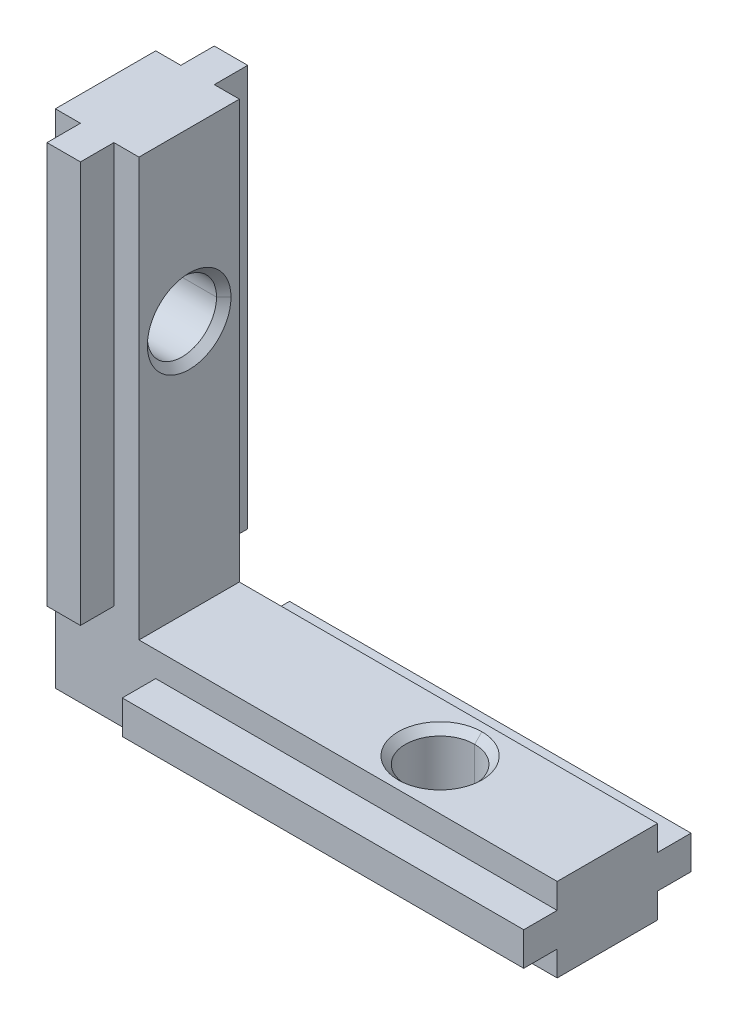
ISO-10303-21;
HEADER;
FILE_DESCRIPTION(('STEP AP214'),'2;1');
FILE_NAME('part.step','',(''),(''),'','','');
FILE_SCHEMA(('AUTOMOTIVE_DESIGN { 1 0 10303 214 1 1 1 1 }'));
ENDSEC;
DATA;
#1=APPLICATION_CONTEXT('core data for automotive mechanical design processes');
#2=APPLICATION_PROTOCOL_DEFINITION('international standard','automotive_design',2000,#1);
#3=PRODUCT_CONTEXT('',#1,'mechanical');
#4=PRODUCT('Part','Part','',(#3));
#5=PRODUCT_RELATED_PRODUCT_CATEGORY('part','',(#4));
#6=PRODUCT_DEFINITION_FORMATION('','',#4);
#7=PRODUCT_DEFINITION_CONTEXT('part definition',#1,'design');
#8=PRODUCT_DEFINITION('design','',#6,#7);
#9=PRODUCT_DEFINITION_SHAPE('','',#8);
#10=(LENGTH_UNIT() NAMED_UNIT(*) SI_UNIT(.MILLI.,.METRE.));
#11=(NAMED_UNIT(*) PLANE_ANGLE_UNIT() SI_UNIT($,.RADIAN.));
#12=(NAMED_UNIT(*) SI_UNIT($,.STERADIAN.) SOLID_ANGLE_UNIT());
#13=UNCERTAINTY_MEASURE_WITH_UNIT(LENGTH_MEASURE(1.E-05),#10,'distance_accuracy_value','');
#14=(GEOMETRIC_REPRESENTATION_CONTEXT(3) GLOBAL_UNCERTAINTY_ASSIGNED_CONTEXT((#13)) GLOBAL_UNIT_ASSIGNED_CONTEXT((#10,
#11,#12)) REPRESENTATION_CONTEXT('',''));
#15=CARTESIAN_POINT('',(0.,0.,0.));
#16=DIRECTION('',(0.,0.,1.));
#17=DIRECTION('',(1.,0.,0.));
#18=AXIS2_PLACEMENT_3D('',#15,#16,#17);
#19=CARTESIAN_POINT('',(20.,0.,-2.9));
#20=DIRECTION('',(0.,1.,0.));
#21=DIRECTION('',(0.,0.,1.));
#22=AXIS2_PLACEMENT_3D('',#19,#20,#21);
#23=CYLINDRICAL_SURFACE('',#22,2.067);
#24=DIRECTION('',(0.,1.,0.));
#25=VECTOR('',#24,1.);
#26=CARTESIAN_POINT('',(20.,0.,-4.967));
#27=LINE('',#26,#25);
#28=CARTESIAN_POINT('',(20.,0.433000000043649,-4.96699999996508));
#29=VERTEX_POINT('',#28);
#30=CARTESIAN_POINT('',(20.,4.56700000006549,-4.96699999999992));
#31=VERTEX_POINT('',#30);
#32=EDGE_CURVE('E348',#29,#31,#27,.T.);
#33=ORIENTED_EDGE('',*,*,#32,.F.);
#34=CARTESIAN_POINT('',(20.,0.433000000043649,-2.9));
#35=DIRECTION('',(0.,-1.,0.));
#36=DIRECTION('',(0.,0.,-1.));
#37=AXIS2_PLACEMENT_3D('',#34,#35,#36);
#38=CIRCLE('',#37,2.06699999996508);
#39=CARTESIAN_POINT('',(20.,0.433000000043649,-0.833000000034917));
#40=VERTEX_POINT('',#39);
#41=EDGE_CURVE('E318',#29,#40,#38,.T.);
#42=ORIENTED_EDGE('',*,*,#41,.T.);
#43=DIRECTION('',(0.,1.,0.));
#44=VECTOR('',#43,1.);
#45=CARTESIAN_POINT('',(20.,0.,-0.833));
#46=LINE('',#45,#44);
#47=CARTESIAN_POINT('',(20.,4.56700000006549,-0.833000000000084));
#48=VERTEX_POINT('',#47);
#49=EDGE_CURVE('E343',#40,#48,#46,.T.);
#50=ORIENTED_EDGE('',*,*,#49,.T.);
#51=CARTESIAN_POINT('',(20.,4.56700000006549,-2.9));
#52=DIRECTION('',(0.,1.,0.));
#53=DIRECTION('',(0.,0.,1.));
#54=AXIS2_PLACEMENT_3D('',#51,#52,#53);
#55=CIRCLE('',#54,2.06699999999991);
#56=EDGE_CURVE('E363',#48,#31,#55,.T.);
#57=ORIENTED_EDGE('',*,*,#56,.T.);
#58=EDGE_LOOP('',(#33,#42,#50,#57));
#59=FACE_BOUND('',#58,.T.);
#60=ADVANCED_FACE('F16',(#59),#23,.F.);
#61=CARTESIAN_POINT('',(0.,0.,2.1));
#62=DIRECTION('',(0.,0.,1.));
#63=DIRECTION('',(1.,0.,0.));
#64=AXIS2_PLACEMENT_3D('',#61,#62,#63);
#65=PLANE('',#64);
#66=DIRECTION('',(0.,-1.,0.));
#67=VECTOR('',#66,1.);
#68=CARTESIAN_POINT('',(6.,3.5,2.1));
#69=LINE('',#68,#67);
#70=CARTESIAN_POINT('',(6.,3.5,2.1));
#71=VERTEX_POINT('',#70);
#72=CARTESIAN_POINT('',(6.,1.5,2.1));
#73=VERTEX_POINT('',#72);
#74=EDGE_CURVE('E522',#71,#73,#69,.T.);
#75=ORIENTED_EDGE('',*,*,#74,.T.);
#76=DIRECTION('',(1.,0.,0.));
#77=VECTOR('',#76,1.);
#78=CARTESIAN_POINT('',(6.,1.5,2.1));
#79=LINE('',#78,#77);
#80=CARTESIAN_POINT('',(30.,1.5,2.1));
#81=VERTEX_POINT('',#80);
#82=EDGE_CURVE('E472',#73,#81,#79,.T.);
#83=ORIENTED_EDGE('',*,*,#82,.T.);
#84=DIRECTION('',(0.,-1.,0.));
#85=VECTOR('',#84,1.);
#86=CARTESIAN_POINT('',(30.,0.,2.1));
#87=LINE('',#86,#85);
#88=CARTESIAN_POINT('',(30.,3.5,2.1));
#89=VERTEX_POINT('',#88);
#90=EDGE_CURVE('E319',#89,#81,#87,.T.);
#91=ORIENTED_EDGE('',*,*,#90,.F.);
#92=DIRECTION('',(-1.,0.,0.));
#93=VECTOR('',#92,1.);
#94=CARTESIAN_POINT('',(30.,3.5,2.1));
#95=LINE('',#94,#93);
#96=EDGE_CURVE('E10',#89,#71,#95,.T.);
#97=ORIENTED_EDGE('',*,*,#96,.T.);
#98=EDGE_LOOP('',(#75,#83,#91,#97));
#99=FACE_BOUND('',#98,.T.);
#100=ADVANCED_FACE('F620',(#99),#65,.T.);
#101=CARTESIAN_POINT('',(5.,20.,-2.9));
#102=DIRECTION('',(-1.,0.,0.));
#103=DIRECTION('',(0.,0.,1.));
#104=AXIS2_PLACEMENT_3D('',#101,#102,#103);
#105=CYLINDRICAL_SURFACE('',#104,2.067);
#106=DIRECTION('',(-1.,0.,0.));
#107=VECTOR('',#106,1.);
#108=CARTESIAN_POINT('',(5.,20.,-4.967));
#109=LINE('',#108,#107);
#110=CARTESIAN_POINT('',(4.56699999989496,20.,-4.96699999996508));
#111=VERTEX_POINT('',#110);
#112=CARTESIAN_POINT('',(0.432999999929962,20.,-4.96700000005676));
#113=VERTEX_POINT('',#112);
#114=EDGE_CURVE('E396',#111,#113,#109,.T.);
#115=ORIENTED_EDGE('',*,*,#114,.F.);
#116=CARTESIAN_POINT('',(4.56699999989496,20.,-2.9));
#117=DIRECTION('',(1.,0.,0.));
#118=DIRECTION('',(0.,0.,-1.));
#119=AXIS2_PLACEMENT_3D('',#116,#117,#118);
#120=CIRCLE('',#119,2.06699999996508);
#121=CARTESIAN_POINT('',(4.56699999989496,20.,-0.833000000034917));
#122=VERTEX_POINT('',#121);
#123=EDGE_CURVE('E366',#111,#122,#120,.T.);
#124=ORIENTED_EDGE('',*,*,#123,.T.);
#125=DIRECTION('',(-1.,0.,0.));
#126=VECTOR('',#125,1.);
#127=CARTESIAN_POINT('',(5.,20.,-0.833));
#128=LINE('',#127,#126);
#129=CARTESIAN_POINT('',(0.432999999929962,20.,-0.83299999994324));
#130=VERTEX_POINT('',#129);
#131=EDGE_CURVE('E533',#122,#130,#128,.T.);
#132=ORIENTED_EDGE('',*,*,#131,.T.);
#133=CARTESIAN_POINT('',(0.432999999929962,20.,-2.9));
#134=DIRECTION('',(-1.,0.,0.));
#135=DIRECTION('',(0.,0.,1.));
#136=AXIS2_PLACEMENT_3D('',#133,#134,#135);
#137=CIRCLE('',#136,2.06700000005676);
#138=EDGE_CURVE('E286',#130,#113,#137,.T.);
#139=ORIENTED_EDGE('',*,*,#138,.T.);
#140=EDGE_LOOP('',(#115,#124,#132,#139));
#141=FACE_BOUND('',#140,.T.);
#142=ADVANCED_FACE('F1002',(#141),#105,.F.);
#143=CARTESIAN_POINT('',(1.5,6.,2.1));
#144=DIRECTION('',(0.,1.,0.));
#145=DIRECTION('',(1.,0.,0.));
#146=AXIS2_PLACEMENT_3D('',#143,#144,#145);
#147=PLANE('',#146);
#148=DIRECTION('',(0.,0.,1.));
#149=VECTOR('',#148,1.);
#150=CARTESIAN_POINT('',(3.5,6.,2.1));
#151=LINE('',#150,#149);
#152=CARTESIAN_POINT('',(3.5,6.,0.1));
#153=VERTEX_POINT('',#152);
#154=CARTESIAN_POINT('',(3.5,6.,2.1));
#155=VERTEX_POINT('',#154);
#156=EDGE_CURVE('E412',#153,#155,#151,.T.);
#157=ORIENTED_EDGE('',*,*,#156,.T.);
#158=DIRECTION('',(1.,0.,0.));
#159=VECTOR('',#158,1.);
#160=CARTESIAN_POINT('',(0.,6.,2.1));
#161=LINE('',#160,#159);
#162=CARTESIAN_POINT('',(1.5,6.,2.1));
#163=VERTEX_POINT('',#162);
#164=EDGE_CURVE('E411',#163,#155,#161,.T.);
#165=ORIENTED_EDGE('',*,*,#164,.F.);
#166=DIRECTION('',(0.,0.,-1.));
#167=VECTOR('',#166,1.);
#168=CARTESIAN_POINT('',(1.5,6.,2.1));
#169=LINE('',#168,#167);
#170=CARTESIAN_POINT('',(1.5,6.,0.1));
#171=VERTEX_POINT('',#170);
#172=EDGE_CURVE('E469',#163,#171,#169,.T.);
#173=ORIENTED_EDGE('',*,*,#172,.T.);
#174=DIRECTION('',(1.,0.,0.));
#175=VECTOR('',#174,1.);
#176=CARTESIAN_POINT('',(0.,6.,0.1));
#177=LINE('',#176,#175);
#178=EDGE_CURVE('E392',#171,#153,#177,.T.);
#179=ORIENTED_EDGE('',*,*,#178,.T.);
#180=EDGE_LOOP('',(#157,#165,#173,#179));
#181=FACE_BOUND('',#180,.T.);
#182=ADVANCED_FACE('F647',(#181),#147,.F.);
#183=CARTESIAN_POINT('',(30.,3.5,2.1));
#184=DIRECTION('',(0.,-1.,0.));
#185=DIRECTION('',(0.,0.,-1.));
#186=AXIS2_PLACEMENT_3D('',#183,#184,#185);
#187=PLANE('',#186);
#188=DIRECTION('',(0.,0.,1.));
#189=VECTOR('',#188,1.);
#190=CARTESIAN_POINT('',(6.,3.5,2.1));
#191=LINE('',#190,#189);
#192=CARTESIAN_POINT('',(6.,3.5,0.1));
#193=VERTEX_POINT('',#192);
#194=EDGE_CURVE('E27',#193,#71,#191,.T.);
#195=ORIENTED_EDGE('',*,*,#194,.T.);
#196=ORIENTED_EDGE('',*,*,#96,.F.);
#197=DIRECTION('',(0.,0.,1.));
#198=VECTOR('',#197,1.);
#199=CARTESIAN_POINT('',(30.,3.5,-5.8));
#200=LINE('',#199,#198);
#201=CARTESIAN_POINT('',(30.,3.5,0.1));
#202=VERTEX_POINT('',#201);
#203=EDGE_CURVE('E356',#202,#89,#200,.T.);
#204=ORIENTED_EDGE('',*,*,#203,.F.);
#205=DIRECTION('',(-1.,0.,0.));
#206=VECTOR('',#205,1.);
#207=CARTESIAN_POINT('',(0.,3.5,0.1));
#208=LINE('',#207,#206);
#209=EDGE_CURVE('E503',#202,#193,#208,.T.);
#210=ORIENTED_EDGE('',*,*,#209,.T.);
#211=EDGE_LOOP('',(#195,#196,#204,#210));
#212=FACE_BOUND('',#211,.T.);
#213=ADVANCED_FACE('F615',(#212),#187,.F.);
#214=CARTESIAN_POINT('',(6.,3.5,2.1));
#215=DIRECTION('',(1.,0.,0.));
#216=DIRECTION('',(0.,1.,0.));
#217=AXIS2_PLACEMENT_3D('',#214,#215,#216);
#218=PLANE('',#217);
#219=DIRECTION('',(0.,0.,1.));
#220=VECTOR('',#219,1.);
#221=CARTESIAN_POINT('',(6.,1.5,2.1));
#222=LINE('',#221,#220);
#223=CARTESIAN_POINT('',(6.,1.5,0.1));
#224=VERTEX_POINT('',#223);
#225=EDGE_CURVE('E566',#224,#73,#222,.T.);
#226=ORIENTED_EDGE('',*,*,#225,.T.);
#227=ORIENTED_EDGE('',*,*,#74,.F.);
#228=ORIENTED_EDGE('',*,*,#194,.F.);
#229=DIRECTION('',(0.,-1.,0.));
#230=VECTOR('',#229,1.);
#231=CARTESIAN_POINT('',(6.,0.,0.1));
#232=LINE('',#231,#230);
#233=EDGE_CURVE('E499',#193,#224,#232,.T.);
#234=ORIENTED_EDGE('',*,*,#233,.T.);
#235=EDGE_LOOP('',(#226,#227,#228,#234));
#236=FACE_BOUND('',#235,.T.);
#237=ADVANCED_FACE('F618',(#236),#218,.F.);
#238=CARTESIAN_POINT('',(6.,1.5,2.1));
#239=DIRECTION('',(0.,1.,0.));
#240=DIRECTION('',(1.,0.,0.));
#241=AXIS2_PLACEMENT_3D('',#238,#239,#240);
#242=PLANE('',#241);
#243=DIRECTION('',(0.,0.,-1.));
#244=VECTOR('',#243,1.);
#245=CARTESIAN_POINT('',(30.,1.5,-5.8));
#246=LINE('',#245,#244);
#247=CARTESIAN_POINT('',(30.,1.5,0.1));
#248=VERTEX_POINT('',#247);
#249=EDGE_CURVE('E281',#81,#248,#246,.T.);
#250=ORIENTED_EDGE('',*,*,#249,.F.);
#251=ORIENTED_EDGE('',*,*,#82,.F.);
#252=ORIENTED_EDGE('',*,*,#225,.F.);
#253=DIRECTION('',(1.,0.,0.));
#254=VECTOR('',#253,1.);
#255=CARTESIAN_POINT('',(0.,1.5,0.1));
#256=LINE('',#255,#254);
#257=EDGE_CURVE('E504',#224,#248,#256,.T.);
#258=ORIENTED_EDGE('',*,*,#257,.T.);
#259=EDGE_LOOP('',(#250,#251,#252,#258));
#260=FACE_BOUND('',#259,.T.);
#261=ADVANCED_FACE('F622',(#260),#242,.F.);
#262=CARTESIAN_POINT('',(1.5,30.,2.1));
#263=DIRECTION('',(1.,0.,0.));
#264=DIRECTION('',(0.,1.,0.));
#265=AXIS2_PLACEMENT_3D('',#262,#263,#264);
#266=PLANE('',#265);
#267=ORIENTED_EDGE('',*,*,#172,.F.);
#268=DIRECTION('',(0.,-1.,0.));
#269=VECTOR('',#268,1.);
#270=CARTESIAN_POINT('',(1.5,0.,2.1));
#271=LINE('',#270,#269);
#272=CARTESIAN_POINT('',(1.5,30.,2.1));
#273=VERTEX_POINT('',#272);
#274=EDGE_CURVE('E407',#273,#163,#271,.T.);
#275=ORIENTED_EDGE('',*,*,#274,.F.);
#276=DIRECTION('',(0.,0.,1.));
#277=VECTOR('',#276,1.);
#278=CARTESIAN_POINT('',(1.5,30.,-5.8));
#279=LINE('',#278,#277);
#280=CARTESIAN_POINT('',(1.5,30.,0.1));
#281=VERTEX_POINT('',#280);
#282=EDGE_CURVE('E325',#281,#273,#279,.T.);
#283=ORIENTED_EDGE('',*,*,#282,.F.);
#284=DIRECTION('',(0.,-1.,0.));
#285=VECTOR('',#284,1.);
#286=CARTESIAN_POINT('',(1.5,0.,0.1));
#287=LINE('',#286,#285);
#288=EDGE_CURVE('E287',#281,#171,#287,.T.);
#289=ORIENTED_EDGE('',*,*,#288,.T.);
#290=EDGE_LOOP('',(#267,#275,#283,#289));
#291=FACE_BOUND('',#290,.T.);
#292=ADVANCED_FACE('F1175',(#291),#266,.F.);
#293=CARTESIAN_POINT('',(0.,0.,2.1));
#294=DIRECTION('',(0.,0.,1.));
#295=DIRECTION('',(1.,0.,0.));
#296=AXIS2_PLACEMENT_3D('',#293,#294,#295);
#297=PLANE('',#296);
#298=ORIENTED_EDGE('',*,*,#274,.T.);
#299=ORIENTED_EDGE('',*,*,#164,.T.);
#300=DIRECTION('',(0.,1.,0.));
#301=VECTOR('',#300,1.);
#302=CARTESIAN_POINT('',(3.5,6.,2.1));
#303=LINE('',#302,#301);
#304=CARTESIAN_POINT('',(3.5,30.,2.1));
#305=VERTEX_POINT('',#304);
#306=EDGE_CURVE('E449',#155,#305,#303,.T.);
#307=ORIENTED_EDGE('',*,*,#306,.T.);
#308=DIRECTION('',(1.,0.,0.));
#309=VECTOR('',#308,1.);
#310=CARTESIAN_POINT('',(5.,30.,2.1));
#311=LINE('',#310,#309);
#312=EDGE_CURVE('E371',#273,#305,#311,.T.);
#313=ORIENTED_EDGE('',*,*,#312,.F.);
#314=EDGE_LOOP('',(#298,#299,#307,#313));
#315=FACE_BOUND('',#314,.T.);
#316=ADVANCED_FACE('F989',(#315),#297,.T.);
#317=CARTESIAN_POINT('',(3.5,6.,2.1));
#318=DIRECTION('',(-1.,0.,0.));
#319=DIRECTION('',(0.,0.,1.));
#320=AXIS2_PLACEMENT_3D('',#317,#318,#319);
#321=PLANE('',#320);
#322=DIRECTION('',(0.,0.,-1.));
#323=VECTOR('',#322,1.);
#324=CARTESIAN_POINT('',(3.5,30.,-5.8));
#325=LINE('',#324,#323);
#326=CARTESIAN_POINT('',(3.5,30.,0.1));
#327=VERTEX_POINT('',#326);
#328=EDGE_CURVE('E375',#305,#327,#325,.T.);
#329=ORIENTED_EDGE('',*,*,#328,.F.);
#330=ORIENTED_EDGE('',*,*,#306,.F.);
#331=ORIENTED_EDGE('',*,*,#156,.F.);
#332=DIRECTION('',(0.,1.,0.));
#333=VECTOR('',#332,1.);
#334=CARTESIAN_POINT('',(3.5,0.,0.1));
#335=LINE('',#334,#333);
#336=EDGE_CURVE('E417',#153,#327,#335,.T.);
#337=ORIENTED_EDGE('',*,*,#336,.T.);
#338=EDGE_LOOP('',(#329,#330,#331,#337));
#339=FACE_BOUND('',#338,.T.);
#340=ADVANCED_FACE('F643',(#339),#321,.F.);
#341=CARTESIAN_POINT('',(4.99999999993861,20.,-2.9));
#342=DIRECTION('',(1.,0.,0.));
#343=DIRECTION('',(0.,0.,-1.));
#344=AXIS2_PLACEMENT_3D('',#341,#342,#343);
#345=CONICAL_SURFACE('',#344,2.49999999995189,0.785398163397448);
#346=DIRECTION('',(0.707106781186548,0.,0.707106781186548));
#347=VECTOR('',#346,1.);
#348=CARTESIAN_POINT('',(4.99999999993861,20.,-0.400000000048112));
#349=LINE('',#348,#347);
#350=CARTESIAN_POINT('',(4.99999999999545,20.,-0.399999999991269));
#351=VERTEX_POINT('',#350);
#352=EDGE_CURVE('E384',#122,#351,#349,.T.);
#353=ORIENTED_EDGE('',*,*,#352,.F.);
#354=ORIENTED_EDGE('',*,*,#123,.F.);
#355=DIRECTION('',(0.707106781186548,0.,-0.707106781186548));
#356=VECTOR('',#355,1.);
#357=CARTESIAN_POINT('',(4.99999999993861,20.,-5.39999999995189));
#358=LINE('',#357,#356);
#359=CARTESIAN_POINT('',(4.99999999999545,20.,-5.40000000000873));
#360=VERTEX_POINT('',#359);
#361=EDGE_CURVE('E393',#111,#360,#358,.T.);
#362=ORIENTED_EDGE('',*,*,#361,.T.);
#363=CARTESIAN_POINT('',(4.99999999999545,20.,-2.9));
#364=DIRECTION('',(-1.,0.,0.));
#365=DIRECTION('',(0.,0.,-1.));
#366=AXIS2_PLACEMENT_3D('',#363,#364,#365);
#367=CIRCLE('',#366,2.50000000000873);
#368=EDGE_CURVE('E517',#351,#360,#367,.T.);
#369=ORIENTED_EDGE('',*,*,#368,.F.);
#370=EDGE_LOOP('',(#353,#354,#362,#369));
#371=FACE_BOUND('',#370,.T.);
#372=ADVANCED_FACE('F988',(#371),#345,.F.);
#373=CARTESIAN_POINT('',(20.,4.99999999999545,-2.9));
#374=DIRECTION('',(0.,1.,0.));
#375=DIRECTION('',(0.,0.,1.));
#376=AXIS2_PLACEMENT_3D('',#373,#374,#375);
#377=CONICAL_SURFACE('',#376,2.49999999992988,0.785398163397448);
#378=DIRECTION('',(0.,0.707106781186548,-0.707106781186548));
#379=VECTOR('',#378,1.);
#380=CARTESIAN_POINT('',(20.,4.99999999999545,-5.39999999992988));
#381=LINE('',#380,#379);
#382=CARTESIAN_POINT('',(20.,4.99999999999545,-5.39999999992988));
#383=VERTEX_POINT('',#382);
#384=EDGE_CURVE('E573',#31,#383,#381,.T.);
#385=ORIENTED_EDGE('',*,*,#384,.F.);
#386=ORIENTED_EDGE('',*,*,#56,.F.);
#387=DIRECTION('',(0.,0.707106781186548,0.707106781186548));
#388=VECTOR('',#387,1.);
#389=CARTESIAN_POINT('',(20.,4.99999999999545,-0.400000000070122));
#390=LINE('',#389,#388);
#391=CARTESIAN_POINT('',(20.,4.99999999999545,-0.400000000070122));
#392=VERTEX_POINT('',#391);
#393=EDGE_CURVE('E349',#48,#392,#390,.T.);
#394=ORIENTED_EDGE('',*,*,#393,.T.);
#395=CARTESIAN_POINT('',(20.,4.99999999999545,-2.9));
#396=DIRECTION('',(0.,-1.,0.));
#397=DIRECTION('',(0.,0.,1.));
#398=AXIS2_PLACEMENT_3D('',#395,#396,#397);
#399=CIRCLE('',#398,2.49999999992988);
#400=EDGE_CURVE('E439',#383,#392,#399,.T.);
#401=ORIENTED_EDGE('',*,*,#400,.F.);
#402=EDGE_LOOP('',(#385,#386,#394,#401));
#403=FACE_BOUND('',#402,.T.);
#404=ADVANCED_FACE('F1055',(#403),#377,.F.);
#405=CARTESIAN_POINT('',(0.,0.,-7.9));
#406=DIRECTION('',(0.,0.,1.));
#407=DIRECTION('',(1.,0.,0.));
#408=AXIS2_PLACEMENT_3D('',#405,#406,#407);
#409=PLANE('',#408);
#410=DIRECTION('',(1.,0.,0.));
#411=VECTOR('',#410,1.);
#412=CARTESIAN_POINT('',(6.,1.5,-7.9));
#413=LINE('',#412,#411);
#414=CARTESIAN_POINT('',(6.,1.5,-7.9));
#415=VERTEX_POINT('',#414);
#416=CARTESIAN_POINT('',(30.,1.5,-7.9));
#417=VERTEX_POINT('',#416);
#418=EDGE_CURVE('E336',#415,#417,#413,.T.);
#419=ORIENTED_EDGE('',*,*,#418,.F.);
#420=DIRECTION('',(0.,-1.,0.));
#421=VECTOR('',#420,1.);
#422=CARTESIAN_POINT('',(6.,3.5,-7.9));
#423=LINE('',#422,#421);
#424=CARTESIAN_POINT('',(6.,3.5,-7.9));
#425=VERTEX_POINT('',#424);
#426=EDGE_CURVE('E462',#425,#415,#423,.T.);
#427=ORIENTED_EDGE('',*,*,#426,.F.);
#428=DIRECTION('',(-1.,0.,0.));
#429=VECTOR('',#428,1.);
#430=CARTESIAN_POINT('',(30.,3.5,-7.9));
#431=LINE('',#430,#429);
#432=CARTESIAN_POINT('',(30.,3.5,-7.9));
#433=VERTEX_POINT('',#432);
#434=EDGE_CURVE('E461',#433,#425,#431,.T.);
#435=ORIENTED_EDGE('',*,*,#434,.F.);
#436=DIRECTION('',(0.,1.,0.));
#437=VECTOR('',#436,1.);
#438=CARTESIAN_POINT('',(30.,0.,-7.9));
#439=LINE('',#438,#437);
#440=EDGE_CURVE('E383',#417,#433,#439,.T.);
#441=ORIENTED_EDGE('',*,*,#440,.F.);
#442=EDGE_LOOP('',(#419,#427,#435,#441));
#443=FACE_BOUND('',#442,.T.);
#444=ADVANCED_FACE('F672',(#443),#409,.F.);
#445=CARTESIAN_POINT('',(20.,-5.6843418860808E-11,-2.9));
#446=DIRECTION('',(0.,-1.,0.));
#447=DIRECTION('',(0.,0.,-1.));
#448=AXIS2_PLACEMENT_3D('',#445,#446,#447);
#449=CONICAL_SURFACE('',#448,2.50000000006558,0.785398163397448);
#450=DIRECTION('',(0.,-0.707106781186548,0.707106781186548));
#451=VECTOR('',#450,1.);
#452=CARTESIAN_POINT('',(20.,-5.6843418860808E-11,-0.399999999934425));
#453=LINE('',#452,#451);
#454=CARTESIAN_POINT('',(20.,0.,-0.399999999991269));
#455=VERTEX_POINT('',#454);
#456=EDGE_CURVE('E337',#40,#455,#453,.T.);
#457=ORIENTED_EDGE('',*,*,#456,.F.);
#458=ORIENTED_EDGE('',*,*,#41,.F.);
#459=DIRECTION('',(0.,-0.707106781186548,-0.707106781186548));
#460=VECTOR('',#459,1.);
#461=CARTESIAN_POINT('',(20.,-5.6843418860808E-11,-5.40000000006558));
#462=LINE('',#461,#460);
#463=CARTESIAN_POINT('',(20.,0.,-5.40000000000873));
#464=VERTEX_POINT('',#463);
#465=EDGE_CURVE('E476',#29,#464,#462,.T.);
#466=ORIENTED_EDGE('',*,*,#465,.T.);
#467=CARTESIAN_POINT('',(20.,0.,-2.9));
#468=DIRECTION('',(0.,1.,0.));
#469=DIRECTION('',(0.,0.,-1.));
#470=AXIS2_PLACEMENT_3D('',#467,#468,#469);
#471=CIRCLE('',#470,2.50000000000873);
#472=EDGE_CURVE('E297',#455,#464,#471,.T.);
#473=ORIENTED_EDGE('',*,*,#472,.F.);
#474=EDGE_LOOP('',(#457,#458,#466,#473));
#475=FACE_BOUND('',#474,.T.);
#476=ADVANCED_FACE('F18',(#475),#449,.F.);
#477=CARTESIAN_POINT('',(30.,0.,-5.8));
#478=DIRECTION('',(1.,0.,0.));
#479=DIRECTION('',(0.,1.,0.));
#480=AXIS2_PLACEMENT_3D('',#477,#478,#479);
#481=PLANE('',#480);
#482=DIRECTION('',(0.,-1.,0.));
#483=VECTOR('',#482,1.);
#484=CARTESIAN_POINT('',(30.,0.,0.1));
#485=LINE('',#484,#483);
#486=CARTESIAN_POINT('',(30.,0.,0.1));
#487=VERTEX_POINT('',#486);
#488=EDGE_CURVE('E272',#248,#487,#485,.T.);
#489=ORIENTED_EDGE('',*,*,#488,.T.);
#490=DIRECTION('',(0.,0.,1.));
#491=VECTOR('',#490,1.);
#492=CARTESIAN_POINT('',(30.,0.,-5.8));
#493=LINE('',#492,#491);
#494=CARTESIAN_POINT('',(30.,0.,-5.9));
#495=VERTEX_POINT('',#494);
#496=EDGE_CURVE('E277',#495,#487,#493,.T.);
#497=ORIENTED_EDGE('',*,*,#496,.F.);
#498=DIRECTION('',(0.,1.,0.));
#499=VECTOR('',#498,1.);
#500=CARTESIAN_POINT('',(30.,0.,-5.9));
#501=LINE('',#500,#499);
#502=CARTESIAN_POINT('',(30.,1.5,-5.9));
#503=VERTEX_POINT('',#502);
#504=EDGE_CURVE('E432',#495,#503,#501,.T.);
#505=ORIENTED_EDGE('',*,*,#504,.T.);
#506=DIRECTION('',(0.,0.,1.));
#507=VECTOR('',#506,1.);
#508=CARTESIAN_POINT('',(30.,1.5,-7.9));
#509=LINE('',#508,#507);
#510=EDGE_CURVE('E413',#417,#503,#509,.T.);
#511=ORIENTED_EDGE('',*,*,#510,.F.);
#512=ORIENTED_EDGE('',*,*,#440,.T.);
#513=DIRECTION('',(0.,0.,-1.));
#514=VECTOR('',#513,1.);
#515=CARTESIAN_POINT('',(30.,3.5,-7.9));
#516=LINE('',#515,#514);
#517=CARTESIAN_POINT('',(30.,3.5,-5.9));
#518=VERTEX_POINT('',#517);
#519=EDGE_CURVE('E491',#518,#433,#516,.T.);
#520=ORIENTED_EDGE('',*,*,#519,.F.);
#521=DIRECTION('',(0.,1.,0.));
#522=VECTOR('',#521,1.);
#523=CARTESIAN_POINT('',(30.,0.,-5.9));
#524=LINE('',#523,#522);
#525=CARTESIAN_POINT('',(30.,5.,-5.9));
#526=VERTEX_POINT('',#525);
#527=EDGE_CURVE('E427',#518,#526,#524,.T.);
#528=ORIENTED_EDGE('',*,*,#527,.T.);
#529=DIRECTION('',(0.,0.,-1.));
#530=VECTOR('',#529,1.);
#531=CARTESIAN_POINT('',(30.,5.,-5.8));
#532=LINE('',#531,#530);
#533=CARTESIAN_POINT('',(30.,5.,0.1));
#534=VERTEX_POINT('',#533);
#535=EDGE_CURVE('E436',#534,#526,#532,.T.);
#536=ORIENTED_EDGE('',*,*,#535,.F.);
#537=DIRECTION('',(0.,-1.,0.));
#538=VECTOR('',#537,1.);
#539=CARTESIAN_POINT('',(30.,0.,0.1));
#540=LINE('',#539,#538);
#541=EDGE_CURVE('E420',#534,#202,#540,.T.);
#542=ORIENTED_EDGE('',*,*,#541,.T.);
#543=ORIENTED_EDGE('',*,*,#203,.T.);
#544=ORIENTED_EDGE('',*,*,#90,.T.);
#545=ORIENTED_EDGE('',*,*,#249,.T.);
#546=EDGE_LOOP('',(#489,#497,#505,#511,#512,#520,#528,#536,#542,#543,#544,#545));
#547=FACE_BOUND('',#546,.T.);
#548=ADVANCED_FACE('F274',(#547),#481,.T.);
#549=CARTESIAN_POINT('',(0.,20.,-2.9));
#550=DIRECTION('',(-1.,0.,0.));
#551=DIRECTION('',(0.,0.,1.));
#552=AXIS2_PLACEMENT_3D('',#549,#550,#551);
#553=CONICAL_SURFACE('',#552,2.49999999992988,0.78539816333181);
#554=DIRECTION('',(-0.707106781232961,0.,-0.707106781140134));
#555=VECTOR('',#554,1.);
#556=CARTESIAN_POINT('',(0.,20.,-5.39999999992988));
#557=LINE('',#556,#555);
#558=CARTESIAN_POINT('',(0.,20.,-5.39999999992988));
#559=VERTEX_POINT('',#558);
#560=EDGE_CURVE('E333',#113,#559,#557,.T.);
#561=ORIENTED_EDGE('',*,*,#560,.F.);
#562=ORIENTED_EDGE('',*,*,#138,.F.);
#563=DIRECTION('',(-0.707106781232961,0.,0.707106781140134));
#564=VECTOR('',#563,1.);
#565=CARTESIAN_POINT('',(0.,20.,-0.400000000070122));
#566=LINE('',#565,#564);
#567=CARTESIAN_POINT('',(0.,20.,-0.400000000070122));
#568=VERTEX_POINT('',#567);
#569=EDGE_CURVE('E332',#130,#568,#566,.T.);
#570=ORIENTED_EDGE('',*,*,#569,.T.);
#571=CARTESIAN_POINT('',(0.,20.,-2.9));
#572=DIRECTION('',(1.,0.,0.));
#573=DIRECTION('',(0.,0.,1.));
#574=AXIS2_PLACEMENT_3D('',#571,#572,#573);
#575=CIRCLE('',#574,2.49999999992988);
#576=EDGE_CURVE('E304',#559,#568,#575,.T.);
#577=ORIENTED_EDGE('',*,*,#576,.F.);
#578=EDGE_LOOP('',(#561,#562,#570,#577));
#579=FACE_BOUND('',#578,.T.);
#580=ADVANCED_FACE('F1078',(#579),#553,.F.);
#581=CARTESIAN_POINT('',(0.,0.,0.1));
#582=DIRECTION('',(0.,0.,-1.));
#583=DIRECTION('',(0.,-1.,0.));
#584=AXIS2_PLACEMENT_3D('',#581,#582,#583);
#585=PLANE('',#584);
#586=ORIENTED_EDGE('',*,*,#257,.F.);
#587=ORIENTED_EDGE('',*,*,#233,.F.);
#588=ORIENTED_EDGE('',*,*,#209,.F.);
#589=ORIENTED_EDGE('',*,*,#541,.F.);
#590=DIRECTION('',(1.,0.,0.));
#591=VECTOR('',#590,1.);
#592=CARTESIAN_POINT('',(30.,5.,0.1));
#593=LINE('',#592,#591);
#594=CARTESIAN_POINT('',(5.,5.,0.1));
#595=VERTEX_POINT('',#594);
#596=EDGE_CURVE('E440',#595,#534,#593,.T.);
#597=ORIENTED_EDGE('',*,*,#596,.F.);
#598=DIRECTION('',(0.,-1.,0.));
#599=VECTOR('',#598,1.);
#600=CARTESIAN_POINT('',(5.,5.,0.1));
#601=LINE('',#600,#599);
#602=CARTESIAN_POINT('',(5.,30.,0.1));
#603=VERTEX_POINT('',#602);
#604=EDGE_CURVE('E511',#603,#595,#601,.T.);
#605=ORIENTED_EDGE('',*,*,#604,.F.);
#606=DIRECTION('',(1.,0.,0.));
#607=VECTOR('',#606,1.);
#608=CARTESIAN_POINT('',(5.,30.,0.1));
#609=LINE('',#608,#607);
#610=EDGE_CURVE('E326',#327,#603,#609,.T.);
#611=ORIENTED_EDGE('',*,*,#610,.F.);
#612=ORIENTED_EDGE('',*,*,#336,.F.);
#613=ORIENTED_EDGE('',*,*,#178,.F.);
#614=ORIENTED_EDGE('',*,*,#288,.F.);
#615=DIRECTION('',(1.,0.,0.));
#616=VECTOR('',#615,1.);
#617=CARTESIAN_POINT('',(5.,30.,0.1));
#618=LINE('',#617,#616);
#619=CARTESIAN_POINT('',(0.,30.,0.1));
#620=VERTEX_POINT('',#619);
#621=EDGE_CURVE('E322',#620,#281,#618,.T.);
#622=ORIENTED_EDGE('',*,*,#621,.F.);
#623=DIRECTION('',(0.,1.,0.));
#624=VECTOR('',#623,1.);
#625=CARTESIAN_POINT('',(0.,30.,0.1));
#626=LINE('',#625,#624);
#627=CARTESIAN_POINT('',(0.,0.,0.1));
#628=VERTEX_POINT('',#627);
#629=EDGE_CURVE('E293',#628,#620,#626,.T.);
#630=ORIENTED_EDGE('',*,*,#629,.F.);
#631=DIRECTION('',(-1.,0.,0.));
#632=VECTOR('',#631,1.);
#633=CARTESIAN_POINT('',(0.,0.,0.1));
#634=LINE('',#633,#632);
#635=EDGE_CURVE('E290',#487,#628,#634,.T.);
#636=ORIENTED_EDGE('',*,*,#635,.F.);
#637=ORIENTED_EDGE('',*,*,#488,.F.);
#638=EDGE_LOOP('',(#586,#587,#588,#589,#597,#605,#611,#612,#613,#614,#622,#630,#636,#637));
#639=FACE_BOUND('',#638,.T.);
#640=ADVANCED_FACE('F291',(#639),#585,.F.);
#641=CARTESIAN_POINT('',(5.,30.,-5.8));
#642=DIRECTION('',(0.,1.,0.));
#643=DIRECTION('',(1.,0.,0.));
#644=AXIS2_PLACEMENT_3D('',#641,#642,#643);
#645=PLANE('',#644);
#646=ORIENTED_EDGE('',*,*,#610,.T.);
#647=DIRECTION('',(0.,0.,1.));
#648=VECTOR('',#647,1.);
#649=CARTESIAN_POINT('',(5.,30.,-5.8));
#650=LINE('',#649,#648);
#651=CARTESIAN_POINT('',(5.,30.,-5.9));
#652=VERTEX_POINT('',#651);
#653=EDGE_CURVE('E507',#652,#603,#650,.T.);
#654=ORIENTED_EDGE('',*,*,#653,.F.);
#655=DIRECTION('',(-1.,0.,0.));
#656=VECTOR('',#655,1.);
#657=CARTESIAN_POINT('',(5.,30.,-5.9));
#658=LINE('',#657,#656);
#659=CARTESIAN_POINT('',(3.5,30.,-5.9));
#660=VERTEX_POINT('',#659);
#661=EDGE_CURVE('E360',#652,#660,#658,.T.);
#662=ORIENTED_EDGE('',*,*,#661,.T.);
#663=DIRECTION('',(0.,0.,1.));
#664=VECTOR('',#663,1.);
#665=CARTESIAN_POINT('',(3.5,30.,-7.9));
#666=LINE('',#665,#664);
#667=CARTESIAN_POINT('',(3.5,30.,-7.9));
#668=VERTEX_POINT('',#667);
#669=EDGE_CURVE('E516',#668,#660,#666,.T.);
#670=ORIENTED_EDGE('',*,*,#669,.F.);
#671=DIRECTION('',(-1.,0.,0.));
#672=VECTOR('',#671,1.);
#673=CARTESIAN_POINT('',(0.,30.,-7.9));
#674=LINE('',#673,#672);
#675=CARTESIAN_POINT('',(1.5,30.,-7.9));
#676=VERTEX_POINT('',#675);
#677=EDGE_CURVE('E583',#668,#676,#674,.T.);
#678=ORIENTED_EDGE('',*,*,#677,.T.);
#679=DIRECTION('',(0.,0.,-1.));
#680=VECTOR('',#679,1.);
#681=CARTESIAN_POINT('',(1.5,30.,-7.9));
#682=LINE('',#681,#680);
#683=CARTESIAN_POINT('',(1.5,30.,-5.9));
#684=VERTEX_POINT('',#683);
#685=EDGE_CURVE('E379',#684,#676,#682,.T.);
#686=ORIENTED_EDGE('',*,*,#685,.F.);
#687=DIRECTION('',(-1.,0.,0.));
#688=VECTOR('',#687,1.);
#689=CARTESIAN_POINT('',(5.,30.,-5.9));
#690=LINE('',#689,#688);
#691=CARTESIAN_POINT('',(0.,30.,-5.9));
#692=VERTEX_POINT('',#691);
#693=EDGE_CURVE('E347',#684,#692,#690,.T.);
#694=ORIENTED_EDGE('',*,*,#693,.T.);
#695=DIRECTION('',(0.,0.,-1.));
#696=VECTOR('',#695,1.);
#697=CARTESIAN_POINT('',(0.,30.,-5.8));
#698=LINE('',#697,#696);
#699=EDGE_CURVE('E310',#620,#692,#698,.T.);
#700=ORIENTED_EDGE('',*,*,#699,.F.);
#701=ORIENTED_EDGE('',*,*,#621,.T.);
#702=ORIENTED_EDGE('',*,*,#282,.T.);
#703=ORIENTED_EDGE('',*,*,#312,.T.);
#704=ORIENTED_EDGE('',*,*,#328,.T.);
#705=EDGE_LOOP('',(#646,#654,#662,#670,#678,#686,#694,#700,#701,#702,#703,#704));
#706=FACE_BOUND('',#705,.T.);
#707=ADVANCED_FACE('F635',(#706),#645,.T.);
#708=CARTESIAN_POINT('',(0.,0.,-7.9));
#709=DIRECTION('',(0.,0.,1.));
#710=DIRECTION('',(1.,0.,0.));
#711=AXIS2_PLACEMENT_3D('',#708,#709,#710);
#712=PLANE('',#711);
#713=DIRECTION('',(0.,1.,0.));
#714=VECTOR('',#713,1.);
#715=CARTESIAN_POINT('',(3.5,6.,-7.9));
#716=LINE('',#715,#714);
#717=CARTESIAN_POINT('',(3.5,6.,-7.9));
#718=VERTEX_POINT('',#717);
#719=EDGE_CURVE('E512',#718,#668,#716,.T.);
#720=ORIENTED_EDGE('',*,*,#719,.F.);
#721=DIRECTION('',(1.,0.,0.));
#722=VECTOR('',#721,1.);
#723=CARTESIAN_POINT('',(1.5,6.,-7.9));
#724=LINE('',#723,#722);
#725=CARTESIAN_POINT('',(1.5,6.,-7.9));
#726=VERTEX_POINT('',#725);
#727=EDGE_CURVE('E580',#726,#718,#724,.T.);
#728=ORIENTED_EDGE('',*,*,#727,.F.);
#729=DIRECTION('',(0.,-1.,0.));
#730=VECTOR('',#729,1.);
#731=CARTESIAN_POINT('',(1.5,30.,-7.9));
#732=LINE('',#731,#730);
#733=EDGE_CURVE('E314',#676,#726,#732,.T.);
#734=ORIENTED_EDGE('',*,*,#733,.F.);
#735=ORIENTED_EDGE('',*,*,#677,.F.);
#736=EDGE_LOOP('',(#720,#728,#734,#735));
#737=FACE_BOUND('',#736,.T.);
#738=ADVANCED_FACE('F692',(#737),#712,.F.);
#739=CARTESIAN_POINT('',(1.5,6.,-7.9));
#740=DIRECTION('',(0.,-1.,0.));
#741=DIRECTION('',(0.,0.,-1.));
#742=AXIS2_PLACEMENT_3D('',#739,#740,#741);
#743=PLANE('',#742);
#744=ORIENTED_EDGE('',*,*,#727,.T.);
#745=DIRECTION('',(0.,0.,-1.));
#746=VECTOR('',#745,1.);
#747=CARTESIAN_POINT('',(3.5,6.,-7.9));
#748=LINE('',#747,#746);
#749=CARTESIAN_POINT('',(3.5,6.,-5.9));
#750=VERTEX_POINT('',#749);
#751=EDGE_CURVE('E543',#750,#718,#748,.T.);
#752=ORIENTED_EDGE('',*,*,#751,.F.);
#753=DIRECTION('',(1.,0.,0.));
#754=VECTOR('',#753,1.);
#755=CARTESIAN_POINT('',(0.,6.,-5.9));
#756=LINE('',#755,#754);
#757=CARTESIAN_POINT('',(1.5,6.,-5.9));
#758=VERTEX_POINT('',#757);
#759=EDGE_CURVE('E361',#758,#750,#756,.T.);
#760=ORIENTED_EDGE('',*,*,#759,.F.);
#761=DIRECTION('',(0.,0.,1.));
#762=VECTOR('',#761,1.);
#763=CARTESIAN_POINT('',(1.5,6.,-7.9));
#764=LINE('',#763,#762);
#765=EDGE_CURVE('E456',#726,#758,#764,.T.);
#766=ORIENTED_EDGE('',*,*,#765,.F.);
#767=EDGE_LOOP('',(#744,#752,#760,#766));
#768=FACE_BOUND('',#767,.T.);
#769=ADVANCED_FACE('F1015',(#768),#743,.T.);
#770=CARTESIAN_POINT('',(3.5,6.,-7.9));
#771=DIRECTION('',(1.,0.,0.));
#772=DIRECTION('',(0.,1.,0.));
#773=AXIS2_PLACEMENT_3D('',#770,#771,#772);
#774=PLANE('',#773);
#775=ORIENTED_EDGE('',*,*,#719,.T.);
#776=ORIENTED_EDGE('',*,*,#669,.T.);
#777=DIRECTION('',(0.,1.,0.));
#778=VECTOR('',#777,1.);
#779=CARTESIAN_POINT('',(3.5,0.,-5.9));
#780=LINE('',#779,#778);
#781=EDGE_CURVE('E357',#750,#660,#780,.T.);
#782=ORIENTED_EDGE('',*,*,#781,.F.);
#783=ORIENTED_EDGE('',*,*,#751,.T.);
#784=EDGE_LOOP('',(#775,#776,#782,#783));
#785=FACE_BOUND('',#784,.T.);
#786=ADVANCED_FACE('F684',(#785),#774,.T.);
#787=CARTESIAN_POINT('',(5.,5.,-5.8));
#788=DIRECTION('',(1.,0.,0.));
#789=DIRECTION('',(0.,1.,0.));
#790=AXIS2_PLACEMENT_3D('',#787,#788,#789);
#791=PLANE('',#790);
#792=CARTESIAN_POINT('',(4.99999999999545,20.,-2.9));
#793=DIRECTION('',(-1.,0.,0.));
#794=DIRECTION('',(0.,0.,-1.));
#795=AXIS2_PLACEMENT_3D('',#792,#793,#794);
#796=CIRCLE('',#795,2.50000000000873);
#797=EDGE_CURVE('E388',#360,#351,#796,.T.);
#798=ORIENTED_EDGE('',*,*,#797,.T.);
#799=ORIENTED_EDGE('',*,*,#368,.T.);
#800=EDGE_LOOP('',(#798,#799));
#801=FACE_BOUND('',#800,.T.);
#802=ORIENTED_EDGE('',*,*,#653,.T.);
#803=ORIENTED_EDGE('',*,*,#604,.T.);
#804=DIRECTION('',(0.,0.,1.));
#805=VECTOR('',#804,1.);
#806=CARTESIAN_POINT('',(5.,5.,-5.8));
#807=LINE('',#806,#805);
#808=CARTESIAN_POINT('',(5.,5.,-5.9));
#809=VERTEX_POINT('',#808);
#810=EDGE_CURVE('E484',#809,#595,#807,.T.);
#811=ORIENTED_EDGE('',*,*,#810,.F.);
#812=DIRECTION('',(0.,-1.,0.));
#813=VECTOR('',#812,1.);
#814=CARTESIAN_POINT('',(5.,0.,-5.9));
#815=LINE('',#814,#813);
#816=EDGE_CURVE('E403',#652,#809,#815,.T.);
#817=ORIENTED_EDGE('',*,*,#816,.F.);
#818=EDGE_LOOP('',(#802,#803,#811,#817));
#819=FACE_BOUND('',#818,.T.);
#820=ADVANCED_FACE('F632',(#801,#819),#791,.T.);
#821=CARTESIAN_POINT('',(30.,5.,-5.8));
#822=DIRECTION('',(0.,1.,0.));
#823=DIRECTION('',(1.,0.,0.));
#824=AXIS2_PLACEMENT_3D('',#821,#822,#823);
#825=PLANE('',#824);
#826=CARTESIAN_POINT('',(20.,4.99999999999545,-2.9));
#827=DIRECTION('',(0.,-1.,0.));
#828=DIRECTION('',(0.,0.,1.));
#829=AXIS2_PLACEMENT_3D('',#826,#827,#828);
#830=CIRCLE('',#829,2.49999999992988);
#831=EDGE_CURVE('E353',#392,#383,#830,.T.);
#832=ORIENTED_EDGE('',*,*,#831,.T.);
#833=ORIENTED_EDGE('',*,*,#400,.T.);
#834=EDGE_LOOP('',(#832,#833));
#835=FACE_BOUND('',#834,.T.);
#836=ORIENTED_EDGE('',*,*,#810,.T.);
#837=ORIENTED_EDGE('',*,*,#596,.T.);
#838=ORIENTED_EDGE('',*,*,#535,.T.);
#839=DIRECTION('',(1.,0.,0.));
#840=VECTOR('',#839,1.);
#841=CARTESIAN_POINT('',(0.,5.,-5.9));
#842=LINE('',#841,#840);
#843=EDGE_CURVE('E423',#809,#526,#842,.T.);
#844=ORIENTED_EDGE('',*,*,#843,.F.);
#845=EDGE_LOOP('',(#836,#837,#838,#844));
#846=FACE_BOUND('',#845,.T.);
#847=ADVANCED_FACE('F629',(#835,#846),#825,.T.);
#848=CARTESIAN_POINT('',(30.,3.5,-7.9));
#849=DIRECTION('',(0.,1.,0.));
#850=DIRECTION('',(1.,0.,0.));
#851=AXIS2_PLACEMENT_3D('',#848,#849,#850);
#852=PLANE('',#851);
#853=ORIENTED_EDGE('',*,*,#434,.T.);
#854=DIRECTION('',(0.,0.,-1.));
#855=VECTOR('',#854,1.);
#856=CARTESIAN_POINT('',(6.,3.5,-7.9));
#857=LINE('',#856,#855);
#858=CARTESIAN_POINT('',(6.,3.5,-5.9));
#859=VERTEX_POINT('',#858);
#860=EDGE_CURVE('E457',#859,#425,#857,.T.);
#861=ORIENTED_EDGE('',*,*,#860,.F.);
#862=DIRECTION('',(-1.,0.,0.));
#863=VECTOR('',#862,1.);
#864=CARTESIAN_POINT('',(0.,3.5,-5.9));
#865=LINE('',#864,#863);
#866=EDGE_CURVE('E445',#518,#859,#865,.T.);
#867=ORIENTED_EDGE('',*,*,#866,.F.);
#868=ORIENTED_EDGE('',*,*,#519,.T.);
#869=EDGE_LOOP('',(#853,#861,#867,#868));
#870=FACE_BOUND('',#869,.T.);
#871=ADVANCED_FACE('F675',(#870),#852,.T.);
#872=CARTESIAN_POINT('',(6.,3.5,-7.9));
#873=DIRECTION('',(-1.,0.,0.));
#874=DIRECTION('',(0.,1.,0.));
#875=AXIS2_PLACEMENT_3D('',#872,#873,#874);
#876=PLANE('',#875);
#877=ORIENTED_EDGE('',*,*,#426,.T.);
#878=DIRECTION('',(0.,0.,-1.));
#879=VECTOR('',#878,1.);
#880=CARTESIAN_POINT('',(6.,1.5,-7.9));
#881=LINE('',#880,#879);
#882=CARTESIAN_POINT('',(6.,1.5,-5.9));
#883=VERTEX_POINT('',#882);
#884=EDGE_CURVE('E416',#883,#415,#881,.T.);
#885=ORIENTED_EDGE('',*,*,#884,.F.);
#886=DIRECTION('',(0.,-1.,0.));
#887=VECTOR('',#886,1.);
#888=CARTESIAN_POINT('',(6.,0.,-5.9));
#889=LINE('',#888,#887);
#890=EDGE_CURVE('E441',#859,#883,#889,.T.);
#891=ORIENTED_EDGE('',*,*,#890,.F.);
#892=ORIENTED_EDGE('',*,*,#860,.T.);
#893=EDGE_LOOP('',(#877,#885,#891,#892));
#894=FACE_BOUND('',#893,.T.);
#895=ADVANCED_FACE('F679',(#894),#876,.T.);
#896=CARTESIAN_POINT('',(6.,1.5,-7.9));
#897=DIRECTION('',(0.,-1.,0.));
#898=DIRECTION('',(0.,0.,-1.));
#899=AXIS2_PLACEMENT_3D('',#896,#897,#898);
#900=PLANE('',#899);
#901=ORIENTED_EDGE('',*,*,#418,.T.);
#902=ORIENTED_EDGE('',*,*,#510,.T.);
#903=DIRECTION('',(1.,0.,0.));
#904=VECTOR('',#903,1.);
#905=CARTESIAN_POINT('',(0.,1.5,-5.9));
#906=LINE('',#905,#904);
#907=EDGE_CURVE('E435',#883,#503,#906,.T.);
#908=ORIENTED_EDGE('',*,*,#907,.F.);
#909=ORIENTED_EDGE('',*,*,#884,.T.);
#910=EDGE_LOOP('',(#901,#902,#908,#909));
#911=FACE_BOUND('',#910,.T.);
#912=ADVANCED_FACE('F669',(#911),#900,.T.);
#913=CARTESIAN_POINT('',(0.,0.,-5.8));
#914=DIRECTION('',(0.,-1.,0.));
#915=DIRECTION('',(0.,0.,-1.));
#916=AXIS2_PLACEMENT_3D('',#913,#914,#915);
#917=PLANE('',#916);
#918=CARTESIAN_POINT('',(20.,0.,-2.9));
#919=DIRECTION('',(0.,1.,0.));
#920=DIRECTION('',(0.,0.,-1.));
#921=AXIS2_PLACEMENT_3D('',#918,#919,#920);
#922=CIRCLE('',#921,2.50000000000873);
#923=EDGE_CURVE('E341',#464,#455,#922,.T.);
#924=ORIENTED_EDGE('',*,*,#923,.T.);
#925=ORIENTED_EDGE('',*,*,#472,.T.);
#926=EDGE_LOOP('',(#924,#925));
#927=FACE_BOUND('',#926,.T.);
#928=ORIENTED_EDGE('',*,*,#496,.T.);
#929=ORIENTED_EDGE('',*,*,#635,.T.);
#930=DIRECTION('',(0.,0.,1.));
#931=VECTOR('',#930,1.);
#932=CARTESIAN_POINT('',(0.,0.,-5.8));
#933=LINE('',#932,#931);
#934=CARTESIAN_POINT('',(0.,0.,-5.9));
#935=VERTEX_POINT('',#934);
#936=EDGE_CURVE('E376',#935,#628,#933,.T.);
#937=ORIENTED_EDGE('',*,*,#936,.F.);
#938=DIRECTION('',(-1.,0.,0.));
#939=VECTOR('',#938,1.);
#940=CARTESIAN_POINT('',(0.,0.,-5.9));
#941=LINE('',#940,#939);
#942=EDGE_CURVE('E301',#495,#935,#941,.T.);
#943=ORIENTED_EDGE('',*,*,#942,.F.);
#944=EDGE_LOOP('',(#928,#929,#937,#943));
#945=FACE_BOUND('',#944,.T.);
#946=ADVANCED_FACE('F299',(#927,#945),#917,.T.);
#947=CARTESIAN_POINT('',(0.,30.,-5.8));
#948=DIRECTION('',(-1.,0.,0.));
#949=DIRECTION('',(0.,0.,1.));
#950=AXIS2_PLACEMENT_3D('',#947,#948,#949);
#951=PLANE('',#950);
#952=CARTESIAN_POINT('',(0.,20.,-2.9));
#953=DIRECTION('',(1.,0.,0.));
#954=DIRECTION('',(0.,0.,1.));
#955=AXIS2_PLACEMENT_3D('',#952,#953,#954);
#956=CIRCLE('',#955,2.49999999992988);
#957=EDGE_CURVE('E328',#568,#559,#956,.T.);
#958=ORIENTED_EDGE('',*,*,#957,.T.);
#959=ORIENTED_EDGE('',*,*,#576,.T.);
#960=EDGE_LOOP('',(#958,#959));
#961=FACE_BOUND('',#960,.T.);
#962=ORIENTED_EDGE('',*,*,#936,.T.);
#963=ORIENTED_EDGE('',*,*,#629,.T.);
#964=ORIENTED_EDGE('',*,*,#699,.T.);
#965=DIRECTION('',(0.,1.,0.));
#966=VECTOR('',#965,1.);
#967=CARTESIAN_POINT('',(0.,0.,-5.9));
#968=LINE('',#967,#966);
#969=EDGE_CURVE('E477',#935,#692,#968,.T.);
#970=ORIENTED_EDGE('',*,*,#969,.F.);
#971=EDGE_LOOP('',(#962,#963,#964,#970));
#972=FACE_BOUND('',#971,.T.);
#973=ADVANCED_FACE('F1027',(#961,#972),#951,.T.);
#974=CARTESIAN_POINT('',(1.5,30.,-7.9));
#975=DIRECTION('',(-1.,0.,0.));
#976=DIRECTION('',(0.,0.,1.));
#977=AXIS2_PLACEMENT_3D('',#974,#975,#976);
#978=PLANE('',#977);
#979=ORIENTED_EDGE('',*,*,#733,.T.);
#980=ORIENTED_EDGE('',*,*,#765,.T.);
#981=DIRECTION('',(0.,-1.,0.));
#982=VECTOR('',#981,1.);
#983=CARTESIAN_POINT('',(1.5,0.,-5.9));
#984=LINE('',#983,#982);
#985=EDGE_CURVE('E431',#684,#758,#984,.T.);
#986=ORIENTED_EDGE('',*,*,#985,.F.);
#987=ORIENTED_EDGE('',*,*,#685,.T.);
#988=EDGE_LOOP('',(#979,#980,#986,#987));
#989=FACE_BOUND('',#988,.T.);
#990=ADVANCED_FACE('F691',(#989),#978,.T.);
#991=CARTESIAN_POINT('',(0.,0.,-5.9));
#992=DIRECTION('',(0.,0.,-1.));
#993=DIRECTION('',(0.,-1.,0.));
#994=AXIS2_PLACEMENT_3D('',#991,#992,#993);
#995=PLANE('',#994);
#996=ORIENTED_EDGE('',*,*,#693,.F.);
#997=ORIENTED_EDGE('',*,*,#985,.T.);
#998=ORIENTED_EDGE('',*,*,#759,.T.);
#999=ORIENTED_EDGE('',*,*,#781,.T.);
#1000=ORIENTED_EDGE('',*,*,#661,.F.);
#1001=ORIENTED_EDGE('',*,*,#816,.T.);
#1002=ORIENTED_EDGE('',*,*,#843,.T.);
#1003=ORIENTED_EDGE('',*,*,#527,.F.);
#1004=ORIENTED_EDGE('',*,*,#866,.T.);
#1005=ORIENTED_EDGE('',*,*,#890,.T.);
#1006=ORIENTED_EDGE('',*,*,#907,.T.);
#1007=ORIENTED_EDGE('',*,*,#504,.F.);
#1008=ORIENTED_EDGE('',*,*,#942,.T.);
#1009=ORIENTED_EDGE('',*,*,#969,.T.);
#1010=EDGE_LOOP('',(#996,#997,#998,#999,#1000,#1001,#1002,#1003,#1004,#1005,#1006,#1007,#1008,#1009));
#1011=FACE_BOUND('',#1010,.T.);
#1012=ADVANCED_FACE('F663',(#1011),#995,.T.);
#1013=CARTESIAN_POINT('',(20.,0.,-2.9));
#1014=DIRECTION('',(0.,1.,0.));
#1015=DIRECTION('',(0.,0.,1.));
#1016=AXIS2_PLACEMENT_3D('',#1013,#1014,#1015);
#1017=CYLINDRICAL_SURFACE('',#1016,2.067);
#1018=CARTESIAN_POINT('',(20.,0.433000000043649,-2.9));
#1019=DIRECTION('',(0.,-1.,0.));
#1020=DIRECTION('',(0.,0.,-1.));
#1021=AXIS2_PLACEMENT_3D('',#1018,#1019,#1020);
#1022=CIRCLE('',#1021,2.06699999996508);
#1023=EDGE_CURVE('E342',#40,#29,#1022,.T.);
#1024=ORIENTED_EDGE('',*,*,#1023,.T.);
#1025=ORIENTED_EDGE('',*,*,#32,.T.);
#1026=CARTESIAN_POINT('',(20.,4.56700000006549,-2.9));
#1027=DIRECTION('',(0.,1.,0.));
#1028=DIRECTION('',(0.,0.,1.));
#1029=AXIS2_PLACEMENT_3D('',#1026,#1027,#1028);
#1030=CIRCLE('',#1029,2.06699999999991);
#1031=EDGE_CURVE('E495',#31,#48,#1030,.T.);
#1032=ORIENTED_EDGE('',*,*,#1031,.T.);
#1033=ORIENTED_EDGE('',*,*,#49,.F.);
#1034=EDGE_LOOP('',(#1024,#1025,#1032,#1033));
#1035=FACE_BOUND('',#1034,.T.);
#1036=ADVANCED_FACE('F969',(#1035),#1017,.F.);
#1037=CARTESIAN_POINT('',(5.,20.,-2.9));
#1038=DIRECTION('',(-1.,0.,0.));
#1039=DIRECTION('',(0.,0.,1.));
#1040=AXIS2_PLACEMENT_3D('',#1037,#1038,#1039);
#1041=CYLINDRICAL_SURFACE('',#1040,2.067);
#1042=CARTESIAN_POINT('',(4.56699999989496,20.,-2.9));
#1043=DIRECTION('',(1.,0.,0.));
#1044=DIRECTION('',(0.,0.,-1.));
#1045=AXIS2_PLACEMENT_3D('',#1042,#1043,#1044);
#1046=CIRCLE('',#1045,2.06699999996508);
#1047=EDGE_CURVE('E20',#122,#111,#1046,.T.);
#1048=ORIENTED_EDGE('',*,*,#1047,.T.);
#1049=ORIENTED_EDGE('',*,*,#114,.T.);
#1050=CARTESIAN_POINT('',(0.432999999929962,20.,-2.9));
#1051=DIRECTION('',(-1.,0.,0.));
#1052=DIRECTION('',(0.,0.,1.));
#1053=AXIS2_PLACEMENT_3D('',#1050,#1051,#1052);
#1054=CIRCLE('',#1053,2.06700000005676);
#1055=EDGE_CURVE('E370',#113,#130,#1054,.T.);
#1056=ORIENTED_EDGE('',*,*,#1055,.T.);
#1057=ORIENTED_EDGE('',*,*,#131,.F.);
#1058=EDGE_LOOP('',(#1048,#1049,#1056,#1057));
#1059=FACE_BOUND('',#1058,.T.);
#1060=ADVANCED_FACE('F974',(#1059),#1041,.F.);
#1061=CARTESIAN_POINT('',(4.99999999993861,20.,-2.9));
#1062=DIRECTION('',(1.,0.,0.));
#1063=DIRECTION('',(0.,0.,-1.));
#1064=AXIS2_PLACEMENT_3D('',#1061,#1062,#1063);
#1065=CONICAL_SURFACE('',#1064,2.49999999995189,0.785398163397448);
#1066=ORIENTED_EDGE('',*,*,#1047,.F.);
#1067=ORIENTED_EDGE('',*,*,#352,.T.);
#1068=ORIENTED_EDGE('',*,*,#797,.F.);
#1069=ORIENTED_EDGE('',*,*,#361,.F.);
#1070=EDGE_LOOP('',(#1066,#1067,#1068,#1069));
#1071=FACE_BOUND('',#1070,.T.);
#1072=ADVANCED_FACE('F1042',(#1071),#1065,.F.);
#1073=CARTESIAN_POINT('',(20.,4.99999999999545,-2.9));
#1074=DIRECTION('',(0.,1.,0.));
#1075=DIRECTION('',(0.,0.,1.));
#1076=AXIS2_PLACEMENT_3D('',#1073,#1074,#1075);
#1077=CONICAL_SURFACE('',#1076,2.49999999992988,0.785398163397448);
#1078=ORIENTED_EDGE('',*,*,#1031,.F.);
#1079=ORIENTED_EDGE('',*,*,#384,.T.);
#1080=ORIENTED_EDGE('',*,*,#831,.F.);
#1081=ORIENTED_EDGE('',*,*,#393,.F.);
#1082=EDGE_LOOP('',(#1078,#1079,#1080,#1081));
#1083=FACE_BOUND('',#1082,.T.);
#1084=ADVANCED_FACE('F1036',(#1083),#1077,.F.);
#1085=CARTESIAN_POINT('',(20.,-5.6843418860808E-11,-2.9));
#1086=DIRECTION('',(0.,-1.,0.));
#1087=DIRECTION('',(0.,0.,-1.));
#1088=AXIS2_PLACEMENT_3D('',#1085,#1086,#1087);
#1089=CONICAL_SURFACE('',#1088,2.50000000006558,0.785398163397448);
#1090=ORIENTED_EDGE('',*,*,#1023,.F.);
#1091=ORIENTED_EDGE('',*,*,#456,.T.);
#1092=ORIENTED_EDGE('',*,*,#923,.F.);
#1093=ORIENTED_EDGE('',*,*,#465,.F.);
#1094=EDGE_LOOP('',(#1090,#1091,#1092,#1093));
#1095=FACE_BOUND('',#1094,.T.);
#1096=ADVANCED_FACE('F1041',(#1095),#1089,.F.);
#1097=CARTESIAN_POINT('',(0.,20.,-2.9));
#1098=DIRECTION('',(-1.,0.,0.));
#1099=DIRECTION('',(0.,0.,1.));
#1100=AXIS2_PLACEMENT_3D('',#1097,#1098,#1099);
#1101=CONICAL_SURFACE('',#1100,2.49999999992988,0.78539816333181);
#1102=ORIENTED_EDGE('',*,*,#1055,.F.);
#1103=ORIENTED_EDGE('',*,*,#560,.T.);
#1104=ORIENTED_EDGE('',*,*,#957,.F.);
#1105=ORIENTED_EDGE('',*,*,#569,.F.);
#1106=EDGE_LOOP('',(#1102,#1103,#1104,#1105));
#1107=FACE_BOUND('',#1106,.T.);
#1108=ADVANCED_FACE('F1090',(#1107),#1101,.F.);
#1109=CLOSED_SHELL('',(#60,#100,#142,#182,#213,#237,#261,#292,#316,#340,#372,#404,#444,#476,
#548,#580,#640,#707,#738,#769,#786,#820,#847,#871,#895,#912,#946,#973,#990,#1012,#1036,#1060,
#1072,#1084,#1096,#1108));
#1110=MANIFOLD_SOLID_BREP('B1',#1109);
#1111=ADVANCED_BREP_SHAPE_REPRESENTATION('',(#18,#1110),#14);
#1112=SHAPE_DEFINITION_REPRESENTATION(#9,#1111);
ENDSEC;
END-ISO-10303-21;
